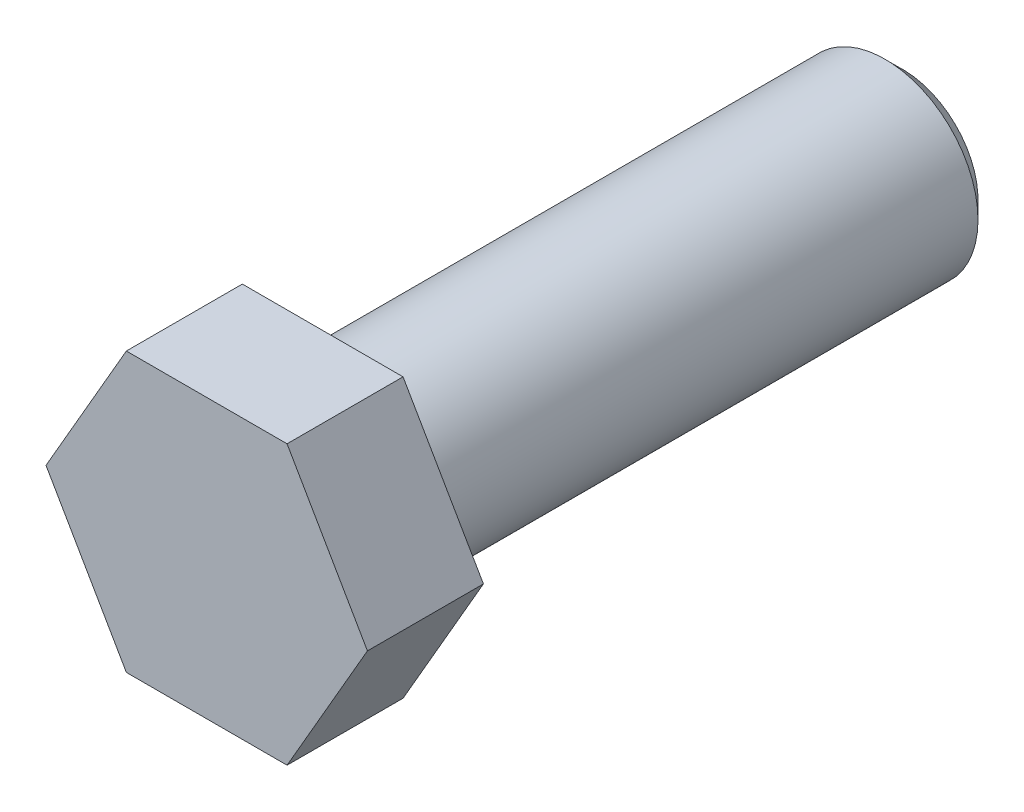
ISO-10303-21;
HEADER;
FILE_DESCRIPTION(('STEP AP214'),'2;1');
FILE_NAME('part.step','',(''),(''),'','','');
FILE_SCHEMA(('AUTOMOTIVE_DESIGN { 1 0 10303 214 1 1 1 1 }'));
ENDSEC;
DATA;
#1=APPLICATION_CONTEXT('core data for automotive mechanical design processes');
#2=APPLICATION_PROTOCOL_DEFINITION('international standard','automotive_design',2000,#1);
#3=PRODUCT_CONTEXT('',#1,'mechanical');
#4=PRODUCT('Part','Part','',(#3));
#5=PRODUCT_RELATED_PRODUCT_CATEGORY('part','',(#4));
#6=PRODUCT_DEFINITION_FORMATION('','',#4);
#7=PRODUCT_DEFINITION_CONTEXT('part definition',#1,'design');
#8=PRODUCT_DEFINITION('design','',#6,#7);
#9=PRODUCT_DEFINITION_SHAPE('','',#8);
#10=(LENGTH_UNIT() NAMED_UNIT(*) SI_UNIT(.MILLI.,.METRE.));
#11=(NAMED_UNIT(*) PLANE_ANGLE_UNIT() SI_UNIT($,.RADIAN.));
#12=(NAMED_UNIT(*) SI_UNIT($,.STERADIAN.) SOLID_ANGLE_UNIT());
#13=UNCERTAINTY_MEASURE_WITH_UNIT(LENGTH_MEASURE(1.E-05),#10,'distance_accuracy_value','');
#14=(GEOMETRIC_REPRESENTATION_CONTEXT(3) GLOBAL_UNCERTAINTY_ASSIGNED_CONTEXT((#13)) GLOBAL_UNIT_ASSIGNED_CONTEXT((#10,
#11,#12)) REPRESENTATION_CONTEXT('',''));
#15=CARTESIAN_POINT('',(0.,0.,0.));
#16=DIRECTION('',(0.,0.,1.));
#17=DIRECTION('',(1.,0.,0.));
#18=AXIS2_PLACEMENT_3D('',#15,#16,#17);
#19=CARTESIAN_POINT('',(-20.7846096908265,-12.,0.));
#20=DIRECTION('',(0.,0.,1.));
#21=DIRECTION('',(1.,0.,0.));
#22=AXIS2_PLACEMENT_3D('',#19,#20,#21);
#23=PLANE('',#22);
#24=DIRECTION('',(-0.499999999999999,-0.866025403784439,0.));
#25=VECTOR('',#24,1.);
#26=CARTESIAN_POINT('',(-6.92820323027552,12.,0.));
#27=LINE('',#26,#25);
#28=CARTESIAN_POINT('',(-6.92820323027552,12.,0.));
#29=VERTEX_POINT('',#28);
#30=CARTESIAN_POINT('',(-13.856406460551,0.,0.));
#31=VERTEX_POINT('',#30);
#32=EDGE_CURVE('E117',#29,#31,#27,.T.);
#33=ORIENTED_EDGE('',*,*,#32,.F.);
#34=DIRECTION('',(1.,0.,0.));
#35=VECTOR('',#34,1.);
#36=CARTESIAN_POINT('',(-6.92820323027552,12.,0.));
#37=LINE('',#36,#35);
#38=CARTESIAN_POINT('',(6.9282032302755,12.,0.));
#39=VERTEX_POINT('',#38);
#40=EDGE_CURVE('E127',#29,#39,#37,.T.);
#41=ORIENTED_EDGE('',*,*,#40,.T.);
#42=DIRECTION('',(0.5,-0.866025403784438,0.));
#43=VECTOR('',#42,1.);
#44=CARTESIAN_POINT('',(6.9282032302755,12.,0.));
#45=LINE('',#44,#43);
#46=CARTESIAN_POINT('',(13.856406460551,0.,0.));
#47=VERTEX_POINT('',#46);
#48=EDGE_CURVE('E125',#39,#47,#45,.T.);
#49=ORIENTED_EDGE('',*,*,#48,.T.);
#50=DIRECTION('',(-0.499999999999999,-0.866025403784439,0.));
#51=VECTOR('',#50,1.);
#52=CARTESIAN_POINT('',(13.856406460551,0.,0.));
#53=LINE('',#52,#51);
#54=CARTESIAN_POINT('',(6.92820323027551,-12.,0.));
#55=VERTEX_POINT('',#54);
#56=EDGE_CURVE('E96',#47,#55,#53,.T.);
#57=ORIENTED_EDGE('',*,*,#56,.T.);
#58=DIRECTION('',(1.,0.,0.));
#59=VECTOR('',#58,1.);
#60=CARTESIAN_POINT('',(-6.92820323027551,-12.,0.));
#61=LINE('',#60,#59);
#62=CARTESIAN_POINT('',(-6.92820323027551,-12.,0.));
#63=VERTEX_POINT('',#62);
#64=EDGE_CURVE('E121',#63,#55,#61,.T.);
#65=ORIENTED_EDGE('',*,*,#64,.F.);
#66=DIRECTION('',(0.5,-0.866025403784439,0.));
#67=VECTOR('',#66,1.);
#68=CARTESIAN_POINT('',(-13.856406460551,0.,0.));
#69=LINE('',#68,#67);
#70=EDGE_CURVE('E119',#31,#63,#69,.T.);
#71=ORIENTED_EDGE('',*,*,#70,.F.);
#72=EDGE_LOOP('',(#33,#41,#49,#57,#65,#71));
#73=FACE_BOUND('',#72,.T.);
#74=CARTESIAN_POINT('',(0.,0.,0.));
#75=DIRECTION('',(0.,0.,1.));
#76=DIRECTION('',(1.,0.,0.));
#77=AXIS2_PLACEMENT_3D('',#74,#75,#76);
#78=CIRCLE('',#77,8.);
#79=CARTESIAN_POINT('',(8.,0.,0.));
#80=VERTEX_POINT('',#79);
#81=EDGE_CURVE('E139',#80,#80,#78,.F.);
#82=ORIENTED_EDGE('',*,*,#81,.F.);
#83=EDGE_LOOP('',(#82));
#84=FACE_BOUND('',#83,.T.);
#85=ADVANCED_FACE('F31',(#73,#84),#23,.F.);
#86=CARTESIAN_POINT('',(-6.92820323027552,12.,10.));
#87=DIRECTION('',(0.866025403784439,-0.499999999999999,0.));
#88=DIRECTION('',(0.499999999999999,0.866025403784439,0.));
#89=AXIS2_PLACEMENT_3D('',#86,#87,#88);
#90=PLANE('',#89);
#91=ORIENTED_EDGE('',*,*,#32,.T.);
#92=DIRECTION('',(0.,0.,-1.));
#93=VECTOR('',#92,1.);
#94=CARTESIAN_POINT('',(-13.856406460551,0.,10.));
#95=LINE('',#94,#93);
#96=CARTESIAN_POINT('',(-13.856406460551,0.,10.));
#97=VERTEX_POINT('',#96);
#98=EDGE_CURVE('E137',#97,#31,#95,.T.);
#99=ORIENTED_EDGE('',*,*,#98,.F.);
#100=DIRECTION('',(-0.499999999999999,-0.866025403784439,0.));
#101=VECTOR('',#100,1.);
#102=CARTESIAN_POINT('',(-6.92820323027552,12.,10.));
#103=LINE('',#102,#101);
#104=CARTESIAN_POINT('',(-6.92820323027552,12.,10.));
#105=VERTEX_POINT('',#104);
#106=EDGE_CURVE('E130',#105,#97,#103,.T.);
#107=ORIENTED_EDGE('',*,*,#106,.F.);
#108=DIRECTION('',(0.,0.,-1.));
#109=VECTOR('',#108,1.);
#110=CARTESIAN_POINT('',(-6.92820323027552,12.,10.));
#111=LINE('',#110,#109);
#112=EDGE_CURVE('E48',#105,#29,#111,.T.);
#113=ORIENTED_EDGE('',*,*,#112,.T.);
#114=EDGE_LOOP('',(#91,#99,#107,#113));
#115=FACE_BOUND('',#114,.T.);
#116=ADVANCED_FACE('F155',(#115),#90,.F.);
#117=CARTESIAN_POINT('',(-13.856406460551,0.,10.));
#118=DIRECTION('',(0.866025403784439,0.5,0.));
#119=DIRECTION('',(-0.5,0.866025403784439,0.));
#120=AXIS2_PLACEMENT_3D('',#117,#118,#119);
#121=PLANE('',#120);
#122=ORIENTED_EDGE('',*,*,#70,.T.);
#123=DIRECTION('',(0.,0.,-1.));
#124=VECTOR('',#123,1.);
#125=CARTESIAN_POINT('',(-6.92820323027551,-12.,10.));
#126=LINE('',#125,#124);
#127=CARTESIAN_POINT('',(-6.92820323027551,-12.,10.));
#128=VERTEX_POINT('',#127);
#129=EDGE_CURVE('E134',#128,#63,#126,.T.);
#130=ORIENTED_EDGE('',*,*,#129,.F.);
#131=DIRECTION('',(0.5,-0.866025403784439,0.));
#132=VECTOR('',#131,1.);
#133=CARTESIAN_POINT('',(-13.856406460551,0.,10.));
#134=LINE('',#133,#132);
#135=EDGE_CURVE('E81',#97,#128,#134,.T.);
#136=ORIENTED_EDGE('',*,*,#135,.F.);
#137=ORIENTED_EDGE('',*,*,#98,.T.);
#138=EDGE_LOOP('',(#122,#130,#136,#137));
#139=FACE_BOUND('',#138,.T.);
#140=ADVANCED_FACE('F161',(#139),#121,.F.);
#141=CARTESIAN_POINT('',(-6.92820323027551,-12.,10.));
#142=DIRECTION('',(0.,1.,0.));
#143=DIRECTION('',(0.,0.,1.));
#144=AXIS2_PLACEMENT_3D('',#141,#142,#143);
#145=PLANE('',#144);
#146=ORIENTED_EDGE('',*,*,#64,.T.);
#147=DIRECTION('',(0.,0.,-1.));
#148=VECTOR('',#147,1.);
#149=CARTESIAN_POINT('',(6.92820323027551,-12.,10.));
#150=LINE('',#149,#148);
#151=CARTESIAN_POINT('',(6.92820323027551,-12.,10.));
#152=VERTEX_POINT('',#151);
#153=EDGE_CURVE('E100',#152,#55,#150,.T.);
#154=ORIENTED_EDGE('',*,*,#153,.F.);
#155=DIRECTION('',(1.,0.,0.));
#156=VECTOR('',#155,1.);
#157=CARTESIAN_POINT('',(-6.92820323027551,-12.,10.));
#158=LINE('',#157,#156);
#159=EDGE_CURVE('E108',#128,#152,#158,.T.);
#160=ORIENTED_EDGE('',*,*,#159,.F.);
#161=ORIENTED_EDGE('',*,*,#129,.T.);
#162=EDGE_LOOP('',(#146,#154,#160,#161));
#163=FACE_BOUND('',#162,.T.);
#164=ADVANCED_FACE('F173',(#163),#145,.F.);
#165=CARTESIAN_POINT('',(13.856406460551,0.,10.));
#166=DIRECTION('',(0.866025403784439,-0.499999999999999,0.));
#167=DIRECTION('',(0.499999999999999,0.866025403784439,0.));
#168=AXIS2_PLACEMENT_3D('',#165,#166,#167);
#169=PLANE('',#168);
#170=ORIENTED_EDGE('',*,*,#56,.F.);
#171=DIRECTION('',(0.,0.,-1.));
#172=VECTOR('',#171,1.);
#173=CARTESIAN_POINT('',(13.856406460551,0.,10.));
#174=LINE('',#173,#172);
#175=CARTESIAN_POINT('',(13.856406460551,0.,10.));
#176=VERTEX_POINT('',#175);
#177=EDGE_CURVE('E91',#176,#47,#174,.T.);
#178=ORIENTED_EDGE('',*,*,#177,.F.);
#179=DIRECTION('',(-0.499999999999999,-0.866025403784439,0.));
#180=VECTOR('',#179,1.);
#181=CARTESIAN_POINT('',(13.856406460551,0.,10.));
#182=LINE('',#181,#180);
#183=EDGE_CURVE('E94',#176,#152,#182,.T.);
#184=ORIENTED_EDGE('',*,*,#183,.T.);
#185=ORIENTED_EDGE('',*,*,#153,.T.);
#186=EDGE_LOOP('',(#170,#178,#184,#185));
#187=FACE_BOUND('',#186,.T.);
#188=ADVANCED_FACE('F93',(#187),#169,.T.);
#189=CARTESIAN_POINT('',(6.9282032302755,12.,10.));
#190=DIRECTION('',(0.866025403784438,0.5,0.));
#191=DIRECTION('',(-0.5,0.866025403784438,0.));
#192=AXIS2_PLACEMENT_3D('',#189,#190,#191);
#193=PLANE('',#192);
#194=ORIENTED_EDGE('',*,*,#48,.F.);
#195=DIRECTION('',(0.,0.,-1.));
#196=VECTOR('',#195,1.);
#197=CARTESIAN_POINT('',(6.9282032302755,12.,10.));
#198=LINE('',#197,#196);
#199=CARTESIAN_POINT('',(6.9282032302755,12.,10.));
#200=VERTEX_POINT('',#199);
#201=EDGE_CURVE('E68',#200,#39,#198,.T.);
#202=ORIENTED_EDGE('',*,*,#201,.F.);
#203=DIRECTION('',(0.5,-0.866025403784438,0.));
#204=VECTOR('',#203,1.);
#205=CARTESIAN_POINT('',(6.9282032302755,12.,10.));
#206=LINE('',#205,#204);
#207=EDGE_CURVE('E106',#200,#176,#206,.T.);
#208=ORIENTED_EDGE('',*,*,#207,.T.);
#209=ORIENTED_EDGE('',*,*,#177,.T.);
#210=EDGE_LOOP('',(#194,#202,#208,#209));
#211=FACE_BOUND('',#210,.T.);
#212=ADVANCED_FACE('F111',(#211),#193,.T.);
#213=CARTESIAN_POINT('',(-6.92820323027552,12.,10.));
#214=DIRECTION('',(0.,1.,0.));
#215=DIRECTION('',(0.,0.,1.));
#216=AXIS2_PLACEMENT_3D('',#213,#214,#215);
#217=PLANE('',#216);
#218=ORIENTED_EDGE('',*,*,#40,.F.);
#219=ORIENTED_EDGE('',*,*,#112,.F.);
#220=DIRECTION('',(1.,0.,0.));
#221=VECTOR('',#220,1.);
#222=CARTESIAN_POINT('',(-6.92820323027552,12.,10.));
#223=LINE('',#222,#221);
#224=EDGE_CURVE('E112',#105,#200,#223,.T.);
#225=ORIENTED_EDGE('',*,*,#224,.T.);
#226=ORIENTED_EDGE('',*,*,#201,.T.);
#227=EDGE_LOOP('',(#218,#219,#225,#226));
#228=FACE_BOUND('',#227,.T.);
#229=ADVANCED_FACE('F166',(#228),#217,.T.);
#230=CARTESIAN_POINT('',(-20.7846096908265,-12.,10.));
#231=DIRECTION('',(0.,0.,1.));
#232=DIRECTION('',(1.,0.,0.));
#233=AXIS2_PLACEMENT_3D('',#230,#231,#232);
#234=PLANE('',#233);
#235=ORIENTED_EDGE('',*,*,#106,.T.);
#236=ORIENTED_EDGE('',*,*,#135,.T.);
#237=ORIENTED_EDGE('',*,*,#159,.T.);
#238=ORIENTED_EDGE('',*,*,#183,.F.);
#239=ORIENTED_EDGE('',*,*,#207,.F.);
#240=ORIENTED_EDGE('',*,*,#224,.F.);
#241=EDGE_LOOP('',(#235,#236,#237,#238,#239,#240));
#242=FACE_BOUND('',#241,.T.);
#243=ADVANCED_FACE('F104',(#242),#234,.T.);
#244=CARTESIAN_POINT('',(0.,0.,-50.));
#245=DIRECTION('',(0.,0.,1.));
#246=DIRECTION('',(1.,0.,0.));
#247=AXIS2_PLACEMENT_3D('',#244,#245,#246);
#248=CYLINDRICAL_SURFACE('',#247,8.);
#249=CARTESIAN_POINT('',(0.,0.,-48.5));
#250=DIRECTION('',(0.,0.,-1.));
#251=DIRECTION('',(-1.,0.,0.));
#252=AXIS2_PLACEMENT_3D('',#249,#250,#251);
#253=CIRCLE('',#252,8.);
#254=CARTESIAN_POINT('',(-8.,0.,-48.5));
#255=VERTEX_POINT('',#254);
#256=EDGE_CURVE('E11',#255,#255,#253,.F.);
#257=ORIENTED_EDGE('',*,*,#256,.T.);
#258=EDGE_LOOP('',(#257));
#259=FACE_BOUND('',#258,.T.);
#260=ORIENTED_EDGE('',*,*,#81,.T.);
#261=EDGE_LOOP('',(#260));
#262=FACE_BOUND('',#261,.T.);
#263=ADVANCED_FACE('F151',(#259,#262),#248,.T.);
#264=CARTESIAN_POINT('',(0.,0.,-50.));
#265=DIRECTION('',(0.,0.,-1.));
#266=DIRECTION('',(-1.,0.,0.));
#267=AXIS2_PLACEMENT_3D('',#264,#265,#266);
#268=PLANE('',#267);
#269=CARTESIAN_POINT('',(0.,0.,-50.));
#270=DIRECTION('',(0.,0.,-1.));
#271=DIRECTION('',(-1.,0.,0.));
#272=AXIS2_PLACEMENT_3D('',#269,#270,#271);
#273=CIRCLE('',#272,6.49999999999997);
#274=CARTESIAN_POINT('',(-6.49999999999997,0.,-50.));
#275=VERTEX_POINT('',#274);
#276=EDGE_CURVE('E40',#275,#275,#273,.T.);
#277=ORIENTED_EDGE('',*,*,#276,.T.);
#278=EDGE_LOOP('',(#277));
#279=FACE_BOUND('',#278,.T.);
#280=ADVANCED_FACE('F144',(#279),#268,.T.);
#281=CARTESIAN_POINT('',(0.,0.,-50.));
#282=DIRECTION('',(0.,0.,1.));
#283=DIRECTION('',(1.,0.,0.));
#284=AXIS2_PLACEMENT_3D('',#281,#282,#283);
#285=CONICAL_SURFACE('',#284,6.49999999999997,0.785398163397454);
#286=ORIENTED_EDGE('',*,*,#256,.F.);
#287=EDGE_LOOP('',(#286));
#288=FACE_BOUND('',#287,.T.);
#289=ORIENTED_EDGE('',*,*,#276,.F.);
#290=EDGE_LOOP('',(#289));
#291=FACE_BOUND('',#290,.T.);
#292=ADVANCED_FACE('F33',(#288,#291),#285,.T.);
#293=CLOSED_SHELL('',(#85,#116,#140,#164,#188,#212,#229,#243,#263,#280,#292));
#294=MANIFOLD_SOLID_BREP('B2',#293);
#295=ADVANCED_BREP_SHAPE_REPRESENTATION('',(#18,#294),#14);
#296=SHAPE_DEFINITION_REPRESENTATION(#9,#295);
ENDSEC;
END-ISO-10303-21;
